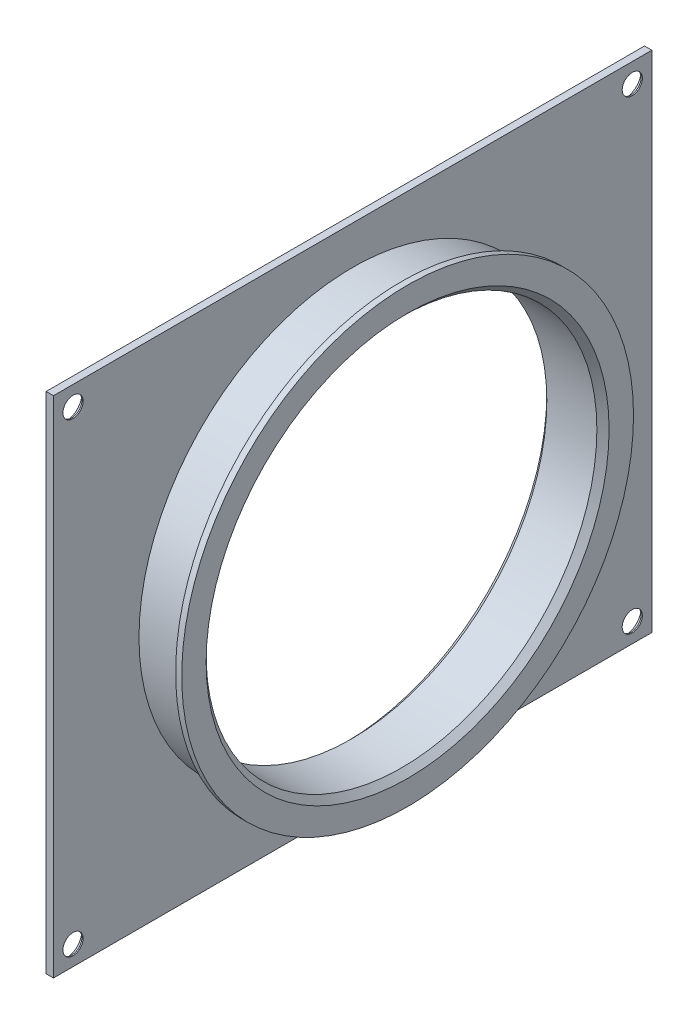
ISO-10303-21;
HEADER;
FILE_DESCRIPTION(('STEP AP214'),'2;1');
FILE_NAME('part.step','',(''),(''),'','','');
FILE_SCHEMA(('AUTOMOTIVE_DESIGN { 1 0 10303 214 1 1 1 1 }'));
ENDSEC;
DATA;
#1=APPLICATION_CONTEXT('core data for automotive mechanical design processes');
#2=APPLICATION_PROTOCOL_DEFINITION('international standard','automotive_design',2000,#1);
#3=PRODUCT_CONTEXT('',#1,'mechanical');
#4=PRODUCT('Part','Part','',(#3));
#5=PRODUCT_RELATED_PRODUCT_CATEGORY('part','',(#4));
#6=PRODUCT_DEFINITION_FORMATION('','',#4);
#7=PRODUCT_DEFINITION_CONTEXT('part definition',#1,'design');
#8=PRODUCT_DEFINITION('design','',#6,#7);
#9=PRODUCT_DEFINITION_SHAPE('','',#8);
#10=(LENGTH_UNIT() NAMED_UNIT(*) SI_UNIT(.MILLI.,.METRE.));
#11=(NAMED_UNIT(*) PLANE_ANGLE_UNIT() SI_UNIT($,.RADIAN.));
#12=(NAMED_UNIT(*) SI_UNIT($,.STERADIAN.) SOLID_ANGLE_UNIT());
#13=UNCERTAINTY_MEASURE_WITH_UNIT(LENGTH_MEASURE(1.E-05),#10,'distance_accuracy_value','');
#14=(GEOMETRIC_REPRESENTATION_CONTEXT(3) GLOBAL_UNCERTAINTY_ASSIGNED_CONTEXT((#13)) GLOBAL_UNIT_ASSIGNED_CONTEXT((#10,
#11,#12)) REPRESENTATION_CONTEXT('',''));
#15=CARTESIAN_POINT('',(0.,0.,0.));
#16=DIRECTION('',(0.,0.,1.));
#17=DIRECTION('',(1.,0.,0.));
#18=AXIS2_PLACEMENT_3D('',#15,#16,#17);
#19=CARTESIAN_POINT('',(1.2,0.,0.));
#20=DIRECTION('',(0.,1.,0.));
#21=DIRECTION('',(0.,0.,1.));
#22=AXIS2_PLACEMENT_3D('',#19,#20,#21);
#23=PLANE('',#22);
#24=DIRECTION('',(0.,0.,-1.));
#25=VECTOR('',#24,1.);
#26=CARTESIAN_POINT('',(0.,0.,0.));
#27=LINE('',#26,#25);
#28=CARTESIAN_POINT('',(0.,0.,98.));
#29=VERTEX_POINT('',#28);
#30=CARTESIAN_POINT('',(0.,0.,0.));
#31=VERTEX_POINT('',#30);
#32=EDGE_CURVE('E117',#29,#31,#27,.T.);
#33=ORIENTED_EDGE('',*,*,#32,.T.);
#34=DIRECTION('',(-1.,0.,0.));
#35=VECTOR('',#34,1.);
#36=CARTESIAN_POINT('',(1.2,0.,0.));
#37=LINE('',#36,#35);
#38=CARTESIAN_POINT('',(1.2,0.,0.));
#39=VERTEX_POINT('',#38);
#40=EDGE_CURVE('E107',#39,#31,#37,.T.);
#41=ORIENTED_EDGE('',*,*,#40,.F.);
#42=DIRECTION('',(0.,0.,-1.));
#43=VECTOR('',#42,1.);
#44=CARTESIAN_POINT('',(1.2,0.,0.));
#45=LINE('',#44,#43);
#46=CARTESIAN_POINT('',(1.2,0.,98.));
#47=VERTEX_POINT('',#46);
#48=EDGE_CURVE('E101',#47,#39,#45,.T.);
#49=ORIENTED_EDGE('',*,*,#48,.F.);
#50=DIRECTION('',(-1.,0.,0.));
#51=VECTOR('',#50,1.);
#52=CARTESIAN_POINT('',(1.2,0.,98.));
#53=LINE('',#52,#51);
#54=EDGE_CURVE('E112',#47,#29,#53,.T.);
#55=ORIENTED_EDGE('',*,*,#54,.T.);
#56=EDGE_LOOP('',(#33,#41,#49,#55));
#57=FACE_BOUND('',#56,.T.);
#58=ADVANCED_FACE('F47',(#57),#23,.F.);
#59=CARTESIAN_POINT('',(1.2,0.,0.));
#60=DIRECTION('',(0.,0.,1.));
#61=DIRECTION('',(1.,0.,0.));
#62=AXIS2_PLACEMENT_3D('',#59,#60,#61);
#63=PLANE('',#62);
#64=DIRECTION('',(0.,1.,0.));
#65=VECTOR('',#64,1.);
#66=CARTESIAN_POINT('',(0.,0.,0.));
#67=LINE('',#66,#65);
#68=CARTESIAN_POINT('',(0.,82.6,0.));
#69=VERTEX_POINT('',#68);
#70=EDGE_CURVE('E108',#31,#69,#67,.T.);
#71=ORIENTED_EDGE('',*,*,#70,.T.);
#72=DIRECTION('',(-1.,0.,0.));
#73=VECTOR('',#72,1.);
#74=CARTESIAN_POINT('',(1.2,82.6,0.));
#75=LINE('',#74,#73);
#76=CARTESIAN_POINT('',(1.2,82.6,0.));
#77=VERTEX_POINT('',#76);
#78=EDGE_CURVE('E106',#77,#69,#75,.T.);
#79=ORIENTED_EDGE('',*,*,#78,.F.);
#80=DIRECTION('',(0.,1.,0.));
#81=VECTOR('',#80,1.);
#82=CARTESIAN_POINT('',(1.2,0.,0.));
#83=LINE('',#82,#81);
#84=EDGE_CURVE('E96',#39,#77,#83,.T.);
#85=ORIENTED_EDGE('',*,*,#84,.F.);
#86=ORIENTED_EDGE('',*,*,#40,.T.);
#87=EDGE_LOOP('',(#71,#79,#85,#86));
#88=FACE_BOUND('',#87,.T.);
#89=ADVANCED_FACE('F110',(#88),#63,.F.);
#90=CARTESIAN_POINT('',(1.2,82.6,0.));
#91=DIRECTION('',(0.,-1.,0.));
#92=DIRECTION('',(0.,0.,-1.));
#93=AXIS2_PLACEMENT_3D('',#90,#91,#92);
#94=PLANE('',#93);
#95=DIRECTION('',(0.,0.,1.));
#96=VECTOR('',#95,1.);
#97=CARTESIAN_POINT('',(0.,82.6,0.));
#98=LINE('',#97,#96);
#99=CARTESIAN_POINT('',(0.,82.6,98.));
#100=VERTEX_POINT('',#99);
#101=EDGE_CURVE('E81',#69,#100,#98,.T.);
#102=ORIENTED_EDGE('',*,*,#101,.T.);
#103=DIRECTION('',(-1.,0.,0.));
#104=VECTOR('',#103,1.);
#105=CARTESIAN_POINT('',(1.2,82.6,98.));
#106=LINE('',#105,#104);
#107=CARTESIAN_POINT('',(1.2,82.6,98.));
#108=VERTEX_POINT('',#107);
#109=EDGE_CURVE('E109',#108,#100,#106,.T.);
#110=ORIENTED_EDGE('',*,*,#109,.F.);
#111=DIRECTION('',(0.,0.,1.));
#112=VECTOR('',#111,1.);
#113=CARTESIAN_POINT('',(1.2,82.6,0.));
#114=LINE('',#113,#112);
#115=EDGE_CURVE('E103',#77,#108,#114,.T.);
#116=ORIENTED_EDGE('',*,*,#115,.F.);
#117=ORIENTED_EDGE('',*,*,#78,.T.);
#118=EDGE_LOOP('',(#102,#110,#116,#117));
#119=FACE_BOUND('',#118,.T.);
#120=ADVANCED_FACE('F115',(#119),#94,.F.);
#121=CARTESIAN_POINT('',(1.2,0.,98.));
#122=DIRECTION('',(0.,0.,-1.));
#123=DIRECTION('',(-1.,0.,0.));
#124=AXIS2_PLACEMENT_3D('',#121,#122,#123);
#125=PLANE('',#124);
#126=DIRECTION('',(0.,-1.,0.));
#127=VECTOR('',#126,1.);
#128=CARTESIAN_POINT('',(0.,0.,98.));
#129=LINE('',#128,#127);
#130=EDGE_CURVE('E89',#100,#29,#129,.T.);
#131=ORIENTED_EDGE('',*,*,#130,.T.);
#132=ORIENTED_EDGE('',*,*,#54,.F.);
#133=DIRECTION('',(0.,-1.,0.));
#134=VECTOR('',#133,1.);
#135=CARTESIAN_POINT('',(1.2,0.,98.));
#136=LINE('',#135,#134);
#137=EDGE_CURVE('E70',#108,#47,#136,.T.);
#138=ORIENTED_EDGE('',*,*,#137,.F.);
#139=ORIENTED_EDGE('',*,*,#109,.T.);
#140=EDGE_LOOP('',(#131,#132,#138,#139));
#141=FACE_BOUND('',#140,.T.);
#142=ADVANCED_FACE('F229',(#141),#125,.F.);
#143=CARTESIAN_POINT('',(1.2,0.,0.));
#144=DIRECTION('',(-1.,0.,0.));
#145=DIRECTION('',(0.,0.,1.));
#146=AXIS2_PLACEMENT_3D('',#143,#144,#145);
#147=PLANE('',#146);
#148=CARTESIAN_POINT('',(1.2,41.3,49.));
#149=DIRECTION('',(1.,0.,0.));
#150=DIRECTION('',(0.,0.,-1.));
#151=AXIS2_PLACEMENT_3D('',#148,#149,#150);
#152=CIRCLE('',#151,35.);
#153=CARTESIAN_POINT('',(1.2,41.3,14.));
#154=VERTEX_POINT('',#153);
#155=EDGE_CURVE('E129',#154,#154,#152,.T.);
#156=ORIENTED_EDGE('',*,*,#155,.F.);
#157=EDGE_LOOP('',(#156));
#158=FACE_BOUND('',#157,.T.);
#159=CARTESIAN_POINT('',(1.2,79.4,94.8));
#160=DIRECTION('',(1.,0.,0.));
#161=DIRECTION('',(0.,0.,-1.));
#162=AXIS2_PLACEMENT_3D('',#159,#160,#161);
#163=CIRCLE('',#162,1.65);
#164=CARTESIAN_POINT('',(1.2,79.4,93.15));
#165=VERTEX_POINT('',#164);
#166=EDGE_CURVE('E409',#165,#165,#163,.T.);
#167=ORIENTED_EDGE('',*,*,#166,.F.);
#168=EDGE_LOOP('',(#167));
#169=FACE_BOUND('',#168,.T.);
#170=CARTESIAN_POINT('',(1.2,3.20000000000001,3.2));
#171=DIRECTION('',(1.,0.,0.));
#172=DIRECTION('',(0.,0.,-1.));
#173=AXIS2_PLACEMENT_3D('',#170,#171,#172);
#174=CIRCLE('',#173,1.65);
#175=CARTESIAN_POINT('',(1.2,3.20000000000001,1.55));
#176=VERTEX_POINT('',#175);
#177=EDGE_CURVE('E410',#176,#176,#174,.T.);
#178=ORIENTED_EDGE('',*,*,#177,.F.);
#179=EDGE_LOOP('',(#178));
#180=FACE_BOUND('',#179,.T.);
#181=CARTESIAN_POINT('',(1.2,79.4,3.19999999999999));
#182=DIRECTION('',(1.,0.,0.));
#183=DIRECTION('',(0.,0.,-1.));
#184=AXIS2_PLACEMENT_3D('',#181,#182,#183);
#185=CIRCLE('',#184,1.65);
#186=CARTESIAN_POINT('',(1.2,79.4,1.54999999999999));
#187=VERTEX_POINT('',#186);
#188=EDGE_CURVE('E400',#187,#187,#185,.T.);
#189=ORIENTED_EDGE('',*,*,#188,.F.);
#190=EDGE_LOOP('',(#189));
#191=FACE_BOUND('',#190,.T.);
#192=CARTESIAN_POINT('',(1.2,3.2,94.8));
#193=DIRECTION('',(1.,0.,0.));
#194=DIRECTION('',(0.,0.,-1.));
#195=AXIS2_PLACEMENT_3D('',#192,#193,#194);
#196=CIRCLE('',#195,1.65);
#197=CARTESIAN_POINT('',(1.2,3.2,93.15));
#198=VERTEX_POINT('',#197);
#199=EDGE_CURVE('E122',#198,#198,#196,.T.);
#200=ORIENTED_EDGE('',*,*,#199,.F.);
#201=EDGE_LOOP('',(#200));
#202=FACE_BOUND('',#201,.T.);
#203=ORIENTED_EDGE('',*,*,#48,.T.);
#204=ORIENTED_EDGE('',*,*,#84,.T.);
#205=ORIENTED_EDGE('',*,*,#115,.T.);
#206=ORIENTED_EDGE('',*,*,#137,.T.);
#207=EDGE_LOOP('',(#203,#204,#205,#206));
#208=FACE_BOUND('',#207,.T.);
#209=ADVANCED_FACE('F100',(#158,#169,#180,#191,#202,#208),#147,.F.);
#210=CARTESIAN_POINT('',(0.,0.,0.));
#211=DIRECTION('',(-1.,0.,0.));
#212=DIRECTION('',(0.,0.,1.));
#213=AXIS2_PLACEMENT_3D('',#210,#211,#212);
#214=PLANE('',#213);
#215=CARTESIAN_POINT('',(0.,79.4,94.8));
#216=DIRECTION('',(-1.,0.,0.));
#217=DIRECTION('',(0.,0.,1.));
#218=AXIS2_PLACEMENT_3D('',#215,#216,#217);
#219=CIRCLE('',#218,2.65000000000001);
#220=CARTESIAN_POINT('',(0.,79.4,97.45));
#221=VERTEX_POINT('',#220);
#222=EDGE_CURVE('E142',#221,#221,#219,.F.);
#223=ORIENTED_EDGE('',*,*,#222,.T.);
#224=EDGE_LOOP('',(#223));
#225=FACE_BOUND('',#224,.T.);
#226=CARTESIAN_POINT('',(0.,79.4,3.19999999999999));
#227=DIRECTION('',(-1.,0.,0.));
#228=DIRECTION('',(0.,0.,1.));
#229=AXIS2_PLACEMENT_3D('',#226,#227,#228);
#230=CIRCLE('',#229,2.65000000000003);
#231=CARTESIAN_POINT('',(0.,79.4,5.85000000000002));
#232=VERTEX_POINT('',#231);
#233=EDGE_CURVE('E140',#232,#232,#230,.F.);
#234=ORIENTED_EDGE('',*,*,#233,.T.);
#235=EDGE_LOOP('',(#234));
#236=FACE_BOUND('',#235,.T.);
#237=CARTESIAN_POINT('',(0.,3.20000000000001,3.2));
#238=DIRECTION('',(-1.,0.,0.));
#239=DIRECTION('',(0.,0.,1.));
#240=AXIS2_PLACEMENT_3D('',#237,#238,#239);
#241=CIRCLE('',#240,2.64999999999999);
#242=CARTESIAN_POINT('',(0.,3.20000000000001,5.84999999999999));
#243=VERTEX_POINT('',#242);
#244=EDGE_CURVE('E134',#243,#243,#241,.F.);
#245=ORIENTED_EDGE('',*,*,#244,.T.);
#246=EDGE_LOOP('',(#245));
#247=FACE_BOUND('',#246,.T.);
#248=CARTESIAN_POINT('',(0.,3.2,94.8));
#249=DIRECTION('',(-1.,0.,0.));
#250=DIRECTION('',(0.,0.,1.));
#251=AXIS2_PLACEMENT_3D('',#248,#249,#250);
#252=CIRCLE('',#251,2.65000000000001);
#253=CARTESIAN_POINT('',(0.,3.2,97.45));
#254=VERTEX_POINT('',#253);
#255=EDGE_CURVE('E135',#254,#254,#252,.F.);
#256=ORIENTED_EDGE('',*,*,#255,.T.);
#257=EDGE_LOOP('',(#256));
#258=FACE_BOUND('',#257,.T.);
#259=CARTESIAN_POINT('',(0.,41.3,49.));
#260=DIRECTION('',(-1.,0.,0.));
#261=DIRECTION('',(0.,0.,1.));
#262=AXIS2_PLACEMENT_3D('',#259,#260,#261);
#263=CIRCLE('',#262,33.);
#264=CARTESIAN_POINT('',(0.,41.3,82.));
#265=VERTEX_POINT('',#264);
#266=EDGE_CURVE('E126',#265,#265,#263,.F.);
#267=ORIENTED_EDGE('',*,*,#266,.T.);
#268=EDGE_LOOP('',(#267));
#269=FACE_BOUND('',#268,.T.);
#270=ORIENTED_EDGE('',*,*,#32,.F.);
#271=ORIENTED_EDGE('',*,*,#130,.F.);
#272=ORIENTED_EDGE('',*,*,#101,.F.);
#273=ORIENTED_EDGE('',*,*,#70,.F.);
#274=EDGE_LOOP('',(#270,#271,#272,#273));
#275=FACE_BOUND('',#274,.T.);
#276=ADVANCED_FACE('F217',(#225,#236,#247,#258,#269,#275),#214,.T.);
#277=CARTESIAN_POINT('',(0.,3.2,94.8));
#278=DIRECTION('',(1.,0.,0.));
#279=DIRECTION('',(0.,0.,-1.));
#280=AXIS2_PLACEMENT_3D('',#277,#278,#279);
#281=CYLINDRICAL_SURFACE('',#280,1.65);
#282=CARTESIAN_POINT('',(1.00000000000001,3.2,94.8));
#283=DIRECTION('',(-1.,0.,0.));
#284=DIRECTION('',(0.,0.,1.));
#285=AXIS2_PLACEMENT_3D('',#282,#283,#284);
#286=CIRCLE('',#285,1.65);
#287=CARTESIAN_POINT('',(1.00000000000001,3.2,96.45));
#288=VERTEX_POINT('',#287);
#289=EDGE_CURVE('E153',#288,#288,#286,.T.);
#290=ORIENTED_EDGE('',*,*,#289,.T.);
#291=EDGE_LOOP('',(#290));
#292=FACE_BOUND('',#291,.T.);
#293=ORIENTED_EDGE('',*,*,#199,.T.);
#294=EDGE_LOOP('',(#293));
#295=FACE_BOUND('',#294,.T.);
#296=ADVANCED_FACE('F221',(#292,#295),#281,.F.);
#297=CARTESIAN_POINT('',(0.,79.4,3.19999999999999));
#298=DIRECTION('',(1.,0.,0.));
#299=DIRECTION('',(0.,0.,-1.));
#300=AXIS2_PLACEMENT_3D('',#297,#298,#299);
#301=CYLINDRICAL_SURFACE('',#300,1.65);
#302=CARTESIAN_POINT('',(1.00000000000002,79.4,3.19999999999999));
#303=DIRECTION('',(-1.,0.,0.));
#304=DIRECTION('',(0.,0.,1.));
#305=AXIS2_PLACEMENT_3D('',#302,#303,#304);
#306=CIRCLE('',#305,1.65);
#307=CARTESIAN_POINT('',(1.00000000000002,79.4,4.85));
#308=VERTEX_POINT('',#307);
#309=EDGE_CURVE('E150',#308,#308,#306,.T.);
#310=ORIENTED_EDGE('',*,*,#309,.T.);
#311=EDGE_LOOP('',(#310));
#312=FACE_BOUND('',#311,.T.);
#313=ORIENTED_EDGE('',*,*,#188,.T.);
#314=EDGE_LOOP('',(#313));
#315=FACE_BOUND('',#314,.T.);
#316=ADVANCED_FACE('F245',(#312,#315),#301,.F.);
#317=CARTESIAN_POINT('',(0.,3.20000000000001,3.2));
#318=DIRECTION('',(1.,0.,0.));
#319=DIRECTION('',(0.,0.,-1.));
#320=AXIS2_PLACEMENT_3D('',#317,#318,#319);
#321=CYLINDRICAL_SURFACE('',#320,1.65);
#322=CARTESIAN_POINT('',(0.999999999999993,3.20000000000001,3.2));
#323=DIRECTION('',(-1.,0.,0.));
#324=DIRECTION('',(0.,0.,1.));
#325=AXIS2_PLACEMENT_3D('',#322,#323,#324);
#326=CIRCLE('',#325,1.65);
#327=CARTESIAN_POINT('',(0.999999999999993,3.20000000000001,4.85));
#328=VERTEX_POINT('',#327);
#329=EDGE_CURVE('E148',#328,#328,#326,.T.);
#330=ORIENTED_EDGE('',*,*,#329,.T.);
#331=EDGE_LOOP('',(#330));
#332=FACE_BOUND('',#331,.T.);
#333=ORIENTED_EDGE('',*,*,#177,.T.);
#334=EDGE_LOOP('',(#333));
#335=FACE_BOUND('',#334,.T.);
#336=ADVANCED_FACE('F242',(#332,#335),#321,.F.);
#337=CARTESIAN_POINT('',(0.,79.4,94.8));
#338=DIRECTION('',(1.,0.,0.));
#339=DIRECTION('',(0.,0.,-1.));
#340=AXIS2_PLACEMENT_3D('',#337,#338,#339);
#341=CYLINDRICAL_SURFACE('',#340,1.65);
#342=CARTESIAN_POINT('',(1.,79.4,94.8));
#343=DIRECTION('',(-1.,0.,0.));
#344=DIRECTION('',(0.,0.,1.));
#345=AXIS2_PLACEMENT_3D('',#342,#343,#344);
#346=CIRCLE('',#345,1.65);
#347=CARTESIAN_POINT('',(1.,79.4,96.45));
#348=VERTEX_POINT('',#347);
#349=EDGE_CURVE('E144',#348,#348,#346,.T.);
#350=ORIENTED_EDGE('',*,*,#349,.T.);
#351=EDGE_LOOP('',(#350));
#352=FACE_BOUND('',#351,.T.);
#353=ORIENTED_EDGE('',*,*,#166,.T.);
#354=EDGE_LOOP('',(#353));
#355=FACE_BOUND('',#354,.T.);
#356=ADVANCED_FACE('F250',(#352,#355),#341,.F.);
#357=CARTESIAN_POINT('',(9.2,41.3,49.));
#358=DIRECTION('',(-1.,0.,0.));
#359=DIRECTION('',(0.,0.,1.));
#360=AXIS2_PLACEMENT_3D('',#357,#358,#359);
#361=CYLINDRICAL_SURFACE('',#360,35.);
#362=CARTESIAN_POINT('',(9.2,41.3,49.));
#363=DIRECTION('',(1.,0.,0.));
#364=DIRECTION('',(0.,0.,-1.));
#365=AXIS2_PLACEMENT_3D('',#362,#363,#364);
#366=CIRCLE('',#365,35.);
#367=CARTESIAN_POINT('',(9.2,41.3,14.));
#368=VERTEX_POINT('',#367);
#369=EDGE_CURVE('E392',#368,#368,#366,.T.);
#370=ORIENTED_EDGE('',*,*,#369,.F.);
#371=EDGE_LOOP('',(#370));
#372=FACE_BOUND('',#371,.T.);
#373=ORIENTED_EDGE('',*,*,#155,.T.);
#374=EDGE_LOOP('',(#373));
#375=FACE_BOUND('',#374,.T.);
#376=ADVANCED_FACE('F252',(#372,#375),#361,.T.);
#377=CARTESIAN_POINT('',(10.2,41.3,49.));
#378=DIRECTION('',(-1.,0.,0.));
#379=DIRECTION('',(0.,0.,1.));
#380=AXIS2_PLACEMENT_3D('',#377,#378,#379);
#381=CYLINDRICAL_SURFACE('',#380,37.);
#382=CARTESIAN_POINT('',(10.2,41.3,49.));
#383=DIRECTION('',(1.,0.,0.));
#384=DIRECTION('',(0.,0.,-1.));
#385=AXIS2_PLACEMENT_3D('',#382,#383,#384);
#386=CIRCLE('',#385,37.);
#387=CARTESIAN_POINT('',(10.2,41.3,12.));
#388=VERTEX_POINT('',#387);
#389=EDGE_CURVE('E393',#388,#388,#386,.T.);
#390=ORIENTED_EDGE('',*,*,#389,.F.);
#391=EDGE_LOOP('',(#390));
#392=FACE_BOUND('',#391,.T.);
#393=CARTESIAN_POINT('',(9.2,41.3,49.));
#394=DIRECTION('',(1.,0.,0.));
#395=DIRECTION('',(0.,0.,-1.));
#396=AXIS2_PLACEMENT_3D('',#393,#394,#395);
#397=CIRCLE('',#396,37.);
#398=CARTESIAN_POINT('',(9.2,41.3,12.));
#399=VERTEX_POINT('',#398);
#400=EDGE_CURVE('E394',#399,#399,#397,.T.);
#401=ORIENTED_EDGE('',*,*,#400,.T.);
#402=EDGE_LOOP('',(#401));
#403=FACE_BOUND('',#402,.T.);
#404=ADVANCED_FACE('F259',(#392,#403),#381,.T.);
#405=CARTESIAN_POINT('',(10.2,41.3,49.));
#406=DIRECTION('',(1.,0.,0.));
#407=DIRECTION('',(0.,0.,-1.));
#408=AXIS2_PLACEMENT_3D('',#405,#406,#407);
#409=PLANE('',#408);
#410=CARTESIAN_POINT('',(10.2,41.3,49.));
#411=DIRECTION('',(1.,0.,0.));
#412=DIRECTION('',(0.,0.,-1.));
#413=AXIS2_PLACEMENT_3D('',#410,#411,#412);
#414=CIRCLE('',#413,33.);
#415=CARTESIAN_POINT('',(10.2,41.3,16.));
#416=VERTEX_POINT('',#415);
#417=EDGE_CURVE('E11',#416,#416,#414,.F.);
#418=ORIENTED_EDGE('',*,*,#417,.T.);
#419=EDGE_LOOP('',(#418));
#420=FACE_BOUND('',#419,.T.);
#421=ORIENTED_EDGE('',*,*,#389,.T.);
#422=EDGE_LOOP('',(#421));
#423=FACE_BOUND('',#422,.T.);
#424=ADVANCED_FACE('F265',(#420,#423),#409,.T.);
#425=CARTESIAN_POINT('',(9.2,41.3,49.));
#426=DIRECTION('',(1.,0.,0.));
#427=DIRECTION('',(0.,0.,-1.));
#428=AXIS2_PLACEMENT_3D('',#425,#426,#427);
#429=PLANE('',#428);
#430=ORIENTED_EDGE('',*,*,#369,.T.);
#431=EDGE_LOOP('',(#430));
#432=FACE_BOUND('',#431,.T.);
#433=ORIENTED_EDGE('',*,*,#400,.F.);
#434=EDGE_LOOP('',(#433));
#435=FACE_BOUND('',#434,.T.);
#436=ADVANCED_FACE('F262',(#432,#435),#429,.F.);
#437=CARTESIAN_POINT('',(0.,41.3,49.));
#438=DIRECTION('',(1.,0.,0.));
#439=DIRECTION('',(0.,0.,-1.));
#440=AXIS2_PLACEMENT_3D('',#437,#438,#439);
#441=CYLINDRICAL_SURFACE('',#440,32.);
#442=CARTESIAN_POINT('',(9.20000000000001,41.3,49.));
#443=DIRECTION('',(1.,0.,0.));
#444=DIRECTION('',(0.,0.,-1.));
#445=AXIS2_PLACEMENT_3D('',#442,#443,#444);
#446=CIRCLE('',#445,32.);
#447=CARTESIAN_POINT('',(9.20000000000001,41.3,17.));
#448=VERTEX_POINT('',#447);
#449=EDGE_CURVE('E56',#448,#448,#446,.T.);
#450=ORIENTED_EDGE('',*,*,#449,.T.);
#451=EDGE_LOOP('',(#450));
#452=FACE_BOUND('',#451,.T.);
#453=CARTESIAN_POINT('',(0.999999999999994,41.3,49.));
#454=DIRECTION('',(-1.,0.,0.));
#455=DIRECTION('',(0.,0.,1.));
#456=AXIS2_PLACEMENT_3D('',#453,#454,#455);
#457=CIRCLE('',#456,32.);
#458=CARTESIAN_POINT('',(0.999999999999994,41.3,81.));
#459=VERTEX_POINT('',#458);
#460=EDGE_CURVE('E159',#459,#459,#457,.T.);
#461=ORIENTED_EDGE('',*,*,#460,.T.);
#462=EDGE_LOOP('',(#461));
#463=FACE_BOUND('',#462,.T.);
#464=ADVANCED_FACE('F163',(#452,#463),#441,.F.);
#465=CARTESIAN_POINT('',(0.,79.4,94.8));
#466=DIRECTION('',(-1.,0.,0.));
#467=DIRECTION('',(0.,0.,1.));
#468=AXIS2_PLACEMENT_3D('',#465,#466,#467);
#469=CONICAL_SURFACE('',#468,2.65000000000001,0.785398163397452);
#470=ORIENTED_EDGE('',*,*,#349,.F.);
#471=EDGE_LOOP('',(#470));
#472=FACE_BOUND('',#471,.T.);
#473=ORIENTED_EDGE('',*,*,#222,.F.);
#474=EDGE_LOOP('',(#473));
#475=FACE_BOUND('',#474,.T.);
#476=ADVANCED_FACE('F189',(#472,#475),#469,.F.);
#477=CARTESIAN_POINT('',(0.,79.4,3.19999999999999));
#478=DIRECTION('',(-1.,0.,0.));
#479=DIRECTION('',(0.,0.,1.));
#480=AXIS2_PLACEMENT_3D('',#477,#478,#479);
#481=CONICAL_SURFACE('',#480,2.65000000000003,0.785398163397451);
#482=ORIENTED_EDGE('',*,*,#309,.F.);
#483=EDGE_LOOP('',(#482));
#484=FACE_BOUND('',#483,.T.);
#485=ORIENTED_EDGE('',*,*,#233,.F.);
#486=EDGE_LOOP('',(#485));
#487=FACE_BOUND('',#486,.T.);
#488=ADVANCED_FACE('F191',(#484,#487),#481,.F.);
#489=CARTESIAN_POINT('',(0.,3.20000000000001,3.2));
#490=DIRECTION('',(-1.,0.,0.));
#491=DIRECTION('',(0.,0.,1.));
#492=AXIS2_PLACEMENT_3D('',#489,#490,#491);
#493=CONICAL_SURFACE('',#492,2.64999999999999,0.785398163397444);
#494=ORIENTED_EDGE('',*,*,#329,.F.);
#495=EDGE_LOOP('',(#494));
#496=FACE_BOUND('',#495,.T.);
#497=ORIENTED_EDGE('',*,*,#244,.F.);
#498=EDGE_LOOP('',(#497));
#499=FACE_BOUND('',#498,.T.);
#500=ADVANCED_FACE('F173',(#496,#499),#493,.F.);
#501=CARTESIAN_POINT('',(0.,3.2,94.8));
#502=DIRECTION('',(-1.,0.,0.));
#503=DIRECTION('',(0.,0.,1.));
#504=AXIS2_PLACEMENT_3D('',#501,#502,#503);
#505=CONICAL_SURFACE('',#504,2.65000000000001,0.785398163397452);
#506=ORIENTED_EDGE('',*,*,#289,.F.);
#507=EDGE_LOOP('',(#506));
#508=FACE_BOUND('',#507,.T.);
#509=ORIENTED_EDGE('',*,*,#255,.F.);
#510=EDGE_LOOP('',(#509));
#511=FACE_BOUND('',#510,.T.);
#512=ADVANCED_FACE('F168',(#508,#511),#505,.F.);
#513=CARTESIAN_POINT('',(9.20000000000001,41.3,49.));
#514=DIRECTION('',(1.,0.,0.));
#515=DIRECTION('',(0.,0.,-1.));
#516=AXIS2_PLACEMENT_3D('',#513,#514,#515);
#517=CONICAL_SURFACE('',#516,32.,0.785398163397448);
#518=ORIENTED_EDGE('',*,*,#417,.F.);
#519=EDGE_LOOP('',(#518));
#520=FACE_BOUND('',#519,.T.);
#521=ORIENTED_EDGE('',*,*,#449,.F.);
#522=EDGE_LOOP('',(#521));
#523=FACE_BOUND('',#522,.T.);
#524=ADVANCED_FACE('F165',(#520,#523),#517,.F.);
#525=CARTESIAN_POINT('',(0.,41.3,49.));
#526=DIRECTION('',(-1.,0.,0.));
#527=DIRECTION('',(0.,0.,1.));
#528=AXIS2_PLACEMENT_3D('',#525,#526,#527);
#529=CONICAL_SURFACE('',#528,33.,0.785398163397448);
#530=ORIENTED_EDGE('',*,*,#460,.F.);
#531=EDGE_LOOP('',(#530));
#532=FACE_BOUND('',#531,.T.);
#533=ORIENTED_EDGE('',*,*,#266,.F.);
#534=EDGE_LOOP('',(#533));
#535=FACE_BOUND('',#534,.T.);
#536=ADVANCED_FACE('F55',(#532,#535),#529,.F.);
#537=CLOSED_SHELL('',(#58,#89,#120,#142,#209,#276,#296,#316,#336,#356,#376,#404,#424,#436,#464,
#476,#488,#500,#512,#524,#536));
#538=MANIFOLD_SOLID_BREP('B2',#537);
#539=ADVANCED_BREP_SHAPE_REPRESENTATION('',(#18,#538),#14);
#540=SHAPE_DEFINITION_REPRESENTATION(#9,#539);
ENDSEC;
END-ISO-10303-21;
